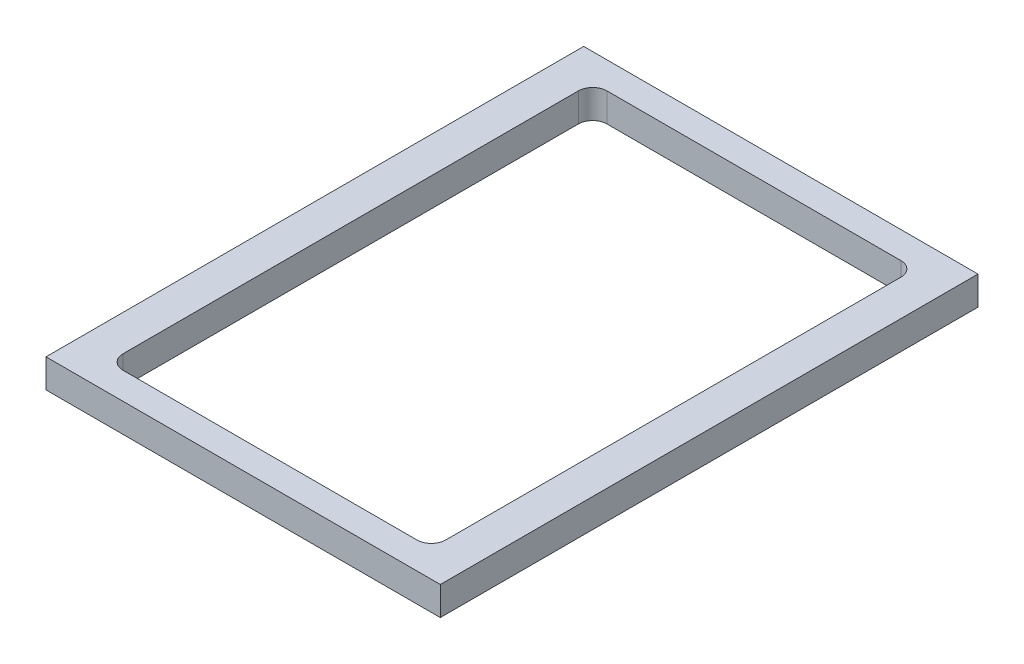
ISO-10303-21;
HEADER;
FILE_DESCRIPTION(('STEP AP214'),'2;1');
FILE_NAME('part.step','',(''),(''),'','','');
FILE_SCHEMA(('AUTOMOTIVE_DESIGN { 1 0 10303 214 1 1 1 1 }'));
ENDSEC;
DATA;
#1=APPLICATION_CONTEXT('core data for automotive mechanical design processes');
#2=APPLICATION_PROTOCOL_DEFINITION('international standard','automotive_design',2000,#1);
#3=PRODUCT_CONTEXT('',#1,'mechanical');
#4=PRODUCT('Part','Part','',(#3));
#5=PRODUCT_RELATED_PRODUCT_CATEGORY('part','',(#4));
#6=PRODUCT_DEFINITION_FORMATION('','',#4);
#7=PRODUCT_DEFINITION_CONTEXT('part definition',#1,'design');
#8=PRODUCT_DEFINITION('design','',#6,#7);
#9=PRODUCT_DEFINITION_SHAPE('','',#8);
#10=(LENGTH_UNIT() NAMED_UNIT(*) SI_UNIT(.MILLI.,.METRE.));
#11=(NAMED_UNIT(*) PLANE_ANGLE_UNIT() SI_UNIT($,.RADIAN.));
#12=(NAMED_UNIT(*) SI_UNIT($,.STERADIAN.) SOLID_ANGLE_UNIT());
#13=UNCERTAINTY_MEASURE_WITH_UNIT(LENGTH_MEASURE(1.E-05),#10,'distance_accuracy_value','');
#14=(GEOMETRIC_REPRESENTATION_CONTEXT(3) GLOBAL_UNCERTAINTY_ASSIGNED_CONTEXT((#13)) GLOBAL_UNIT_ASSIGNED_CONTEXT((#10,
#11,#12)) REPRESENTATION_CONTEXT('',''));
#15=CARTESIAN_POINT('',(0.,0.,0.));
#16=DIRECTION('',(0.,0.,1.));
#17=DIRECTION('',(1.,0.,0.));
#18=AXIS2_PLACEMENT_3D('',#15,#16,#17);
#19=CARTESIAN_POINT('',(-94.5,-113.7,10.5));
#20=DIRECTION('',(0.,0.,1.));
#21=DIRECTION('',(1.,0.,0.));
#22=AXIS2_PLACEMENT_3D('',#19,#20,#21);
#23=PLANE('',#22);
#24=DIRECTION('',(0.,-1.,0.));
#25=VECTOR('',#24,1.);
#26=CARTESIAN_POINT('',(87.,-113.7,10.5));
#27=LINE('',#26,#25);
#28=CARTESIAN_POINT('',(87.,-113.8,10.5));
#29=VERTEX_POINT('',#28);
#30=CARTESIAN_POINT('',(87.,-116.,10.5));
#31=VERTEX_POINT('',#30);
#32=EDGE_CURVE('E41',#29,#31,#27,.T.);
#33=ORIENTED_EDGE('',*,*,#32,.T.);
#34=DIRECTION('',(-1.,0.,0.));
#35=VECTOR('',#34,1.);
#36=CARTESIAN_POINT('',(-47.25,-116.,10.5));
#37=LINE('',#36,#35);
#38=CARTESIAN_POINT('',(-87.,-116.,10.5));
#39=VERTEX_POINT('',#38);
#40=EDGE_CURVE('E313',#31,#39,#37,.T.);
#41=ORIENTED_EDGE('',*,*,#40,.T.);
#42=DIRECTION('',(0.,-1.,0.));
#43=VECTOR('',#42,1.);
#44=CARTESIAN_POINT('',(-87.,-113.7,10.5));
#45=LINE('',#44,#43);
#46=CARTESIAN_POINT('',(-87.,-113.8,10.5));
#47=VERTEX_POINT('',#46);
#48=EDGE_CURVE('E10',#47,#39,#45,.T.);
#49=ORIENTED_EDGE('',*,*,#48,.F.);
#50=DIRECTION('',(-1.,0.,0.));
#51=VECTOR('',#50,1.);
#52=CARTESIAN_POINT('',(-47.25,-113.8,10.5));
#53=LINE('',#52,#51);
#54=EDGE_CURVE('E388',#29,#47,#53,.T.);
#55=ORIENTED_EDGE('',*,*,#54,.F.);
#56=EDGE_LOOP('',(#33,#41,#49,#55));
#57=FACE_BOUND('',#56,.T.);
#58=ADVANCED_FACE('F16',(#57),#23,.F.);
#59=CARTESIAN_POINT('',(-87.,-113.7,18.));
#60=DIRECTION('',(0.,-1.,0.));
#61=DIRECTION('',(0.,0.,-1.));
#62=AXIS2_PLACEMENT_3D('',#59,#60,#61);
#63=CYLINDRICAL_SURFACE('',#62,7.5);
#64=CARTESIAN_POINT('',(-87.,-116.,18.));
#65=DIRECTION('',(0.,-1.,0.));
#66=DIRECTION('',(0.,0.,-1.));
#67=AXIS2_PLACEMENT_3D('',#64,#65,#66);
#68=CIRCLE('',#67,7.5);
#69=CARTESIAN_POINT('',(-94.5,-116.,18.));
#70=VERTEX_POINT('',#69);
#71=EDGE_CURVE('E309',#70,#39,#68,.T.);
#72=ORIENTED_EDGE('',*,*,#71,.F.);
#73=DIRECTION('',(0.,-1.,0.));
#74=VECTOR('',#73,1.);
#75=CARTESIAN_POINT('',(-94.5,-113.7,18.));
#76=LINE('',#75,#74);
#77=CARTESIAN_POINT('',(-94.5,-113.8,18.));
#78=VERTEX_POINT('',#77);
#79=EDGE_CURVE('E27',#78,#70,#76,.T.);
#80=ORIENTED_EDGE('',*,*,#79,.F.);
#81=CARTESIAN_POINT('',(-87.,-113.8,18.));
#82=DIRECTION('',(0.,-1.,0.));
#83=DIRECTION('',(0.,0.,-1.));
#84=AXIS2_PLACEMENT_3D('',#81,#82,#83);
#85=CIRCLE('',#84,7.5);
#86=EDGE_CURVE('E384',#78,#47,#85,.T.);
#87=ORIENTED_EDGE('',*,*,#86,.T.);
#88=ORIENTED_EDGE('',*,*,#48,.T.);
#89=EDGE_LOOP('',(#72,#80,#87,#88));
#90=FACE_BOUND('',#89,.T.);
#91=ADVANCED_FACE('F689',(#90),#63,.T.);
#92=CARTESIAN_POINT('',(-94.5,-113.7,289.5));
#93=DIRECTION('',(1.,0.,0.));
#94=DIRECTION('',(0.,1.,0.));
#95=AXIS2_PLACEMENT_3D('',#92,#93,#94);
#96=PLANE('',#95);
#97=ORIENTED_EDGE('',*,*,#79,.T.);
#98=DIRECTION('',(0.,0.,1.));
#99=VECTOR('',#98,1.);
#100=CARTESIAN_POINT('',(-94.5,-116.,219.75));
#101=LINE('',#100,#99);
#102=CARTESIAN_POINT('',(-94.5,-116.,282.));
#103=VERTEX_POINT('',#102);
#104=EDGE_CURVE('E314',#70,#103,#101,.T.);
#105=ORIENTED_EDGE('',*,*,#104,.T.);
#106=DIRECTION('',(0.,-1.,0.));
#107=VECTOR('',#106,1.);
#108=CARTESIAN_POINT('',(-94.5,-113.7,282.));
#109=LINE('',#108,#107);
#110=CARTESIAN_POINT('',(-94.5,-113.8,282.));
#111=VERTEX_POINT('',#110);
#112=EDGE_CURVE('E300',#111,#103,#109,.T.);
#113=ORIENTED_EDGE('',*,*,#112,.F.);
#114=DIRECTION('',(0.,0.,1.));
#115=VECTOR('',#114,1.);
#116=CARTESIAN_POINT('',(-94.5,-113.8,219.75));
#117=LINE('',#116,#115);
#118=EDGE_CURVE('E350',#78,#111,#117,.T.);
#119=ORIENTED_EDGE('',*,*,#118,.F.);
#120=EDGE_LOOP('',(#97,#105,#113,#119));
#121=FACE_BOUND('',#120,.T.);
#122=ADVANCED_FACE('F543',(#121),#96,.F.);
#123=CARTESIAN_POINT('',(-87.,-113.7,282.));
#124=DIRECTION('',(0.,-1.,0.));
#125=DIRECTION('',(0.,0.,1.));
#126=AXIS2_PLACEMENT_3D('',#123,#124,#125);
#127=CYLINDRICAL_SURFACE('',#126,7.5);
#128=DIRECTION('',(0.,-1.,0.));
#129=VECTOR('',#128,1.);
#130=CARTESIAN_POINT('',(-87.,-113.7,289.5));
#131=LINE('',#130,#129);
#132=CARTESIAN_POINT('',(-87.,-113.8,289.5));
#133=VERTEX_POINT('',#132);
#134=CARTESIAN_POINT('',(-87.,-116.,289.5));
#135=VERTEX_POINT('',#134);
#136=EDGE_CURVE('E20',#133,#135,#131,.T.);
#137=ORIENTED_EDGE('',*,*,#136,.F.);
#138=CARTESIAN_POINT('',(-87.,-113.8,282.));
#139=DIRECTION('',(0.,-1.,0.));
#140=DIRECTION('',(0.,0.,1.));
#141=AXIS2_PLACEMENT_3D('',#138,#139,#140);
#142=CIRCLE('',#141,7.5);
#143=EDGE_CURVE('E345',#133,#111,#142,.T.);
#144=ORIENTED_EDGE('',*,*,#143,.T.);
#145=ORIENTED_EDGE('',*,*,#112,.T.);
#146=CARTESIAN_POINT('',(-87.,-116.,282.));
#147=DIRECTION('',(0.,-1.,0.));
#148=DIRECTION('',(0.,0.,1.));
#149=AXIS2_PLACEMENT_3D('',#146,#147,#148);
#150=CIRCLE('',#149,7.5);
#151=EDGE_CURVE('E427',#135,#103,#150,.T.);
#152=ORIENTED_EDGE('',*,*,#151,.F.);
#153=EDGE_LOOP('',(#137,#144,#145,#152));
#154=FACE_BOUND('',#153,.T.);
#155=ADVANCED_FACE('F701',(#154),#127,.T.);
#156=CARTESIAN_POINT('',(94.5,-113.7,289.5));
#157=DIRECTION('',(0.,0.,-1.));
#158=DIRECTION('',(0.,-1.,0.));
#159=AXIS2_PLACEMENT_3D('',#156,#157,#158);
#160=PLANE('',#159);
#161=ORIENTED_EDGE('',*,*,#136,.T.);
#162=DIRECTION('',(1.,0.,0.));
#163=VECTOR('',#162,1.);
#164=CARTESIAN_POINT('',(47.25,-116.,289.5));
#165=LINE('',#164,#163);
#166=CARTESIAN_POINT('',(87.,-116.,289.5));
#167=VERTEX_POINT('',#166);
#168=EDGE_CURVE('E418',#135,#167,#165,.T.);
#169=ORIENTED_EDGE('',*,*,#168,.T.);
#170=DIRECTION('',(0.,-1.,0.));
#171=VECTOR('',#170,1.);
#172=CARTESIAN_POINT('',(87.,-113.7,289.5));
#173=LINE('',#172,#171);
#174=CARTESIAN_POINT('',(87.,-113.8,289.5));
#175=VERTEX_POINT('',#174);
#176=EDGE_CURVE('E431',#175,#167,#173,.T.);
#177=ORIENTED_EDGE('',*,*,#176,.F.);
#178=DIRECTION('',(1.,0.,0.));
#179=VECTOR('',#178,1.);
#180=CARTESIAN_POINT('',(47.25,-113.8,289.5));
#181=LINE('',#180,#179);
#182=EDGE_CURVE('E349',#133,#175,#181,.T.);
#183=ORIENTED_EDGE('',*,*,#182,.F.);
#184=EDGE_LOOP('',(#161,#169,#177,#183));
#185=FACE_BOUND('',#184,.T.);
#186=ADVANCED_FACE('F589',(#185),#160,.F.);
#187=CARTESIAN_POINT('',(87.,-113.7,282.));
#188=DIRECTION('',(0.,-1.,0.));
#189=DIRECTION('',(1.,0.,0.));
#190=AXIS2_PLACEMENT_3D('',#187,#188,#189);
#191=CYLINDRICAL_SURFACE('',#190,7.5);
#192=DIRECTION('',(0.,-1.,0.));
#193=VECTOR('',#192,1.);
#194=CARTESIAN_POINT('',(94.5,-113.7,282.));
#195=LINE('',#194,#193);
#196=CARTESIAN_POINT('',(94.5,-113.8,282.));
#197=VERTEX_POINT('',#196);
#198=CARTESIAN_POINT('',(94.5,-116.,282.));
#199=VERTEX_POINT('',#198);
#200=EDGE_CURVE('E434',#197,#199,#195,.T.);
#201=ORIENTED_EDGE('',*,*,#200,.F.);
#202=CARTESIAN_POINT('',(87.,-113.8,282.));
#203=DIRECTION('',(0.,-1.,0.));
#204=DIRECTION('',(1.,0.,0.));
#205=AXIS2_PLACEMENT_3D('',#202,#203,#204);
#206=CIRCLE('',#205,7.5);
#207=EDGE_CURVE('E423',#197,#175,#206,.T.);
#208=ORIENTED_EDGE('',*,*,#207,.T.);
#209=ORIENTED_EDGE('',*,*,#176,.T.);
#210=CARTESIAN_POINT('',(87.,-116.,282.));
#211=DIRECTION('',(0.,-1.,0.));
#212=DIRECTION('',(1.,0.,0.));
#213=AXIS2_PLACEMENT_3D('',#210,#211,#212);
#214=CIRCLE('',#213,7.5);
#215=EDGE_CURVE('E414',#199,#167,#214,.T.);
#216=ORIENTED_EDGE('',*,*,#215,.F.);
#217=EDGE_LOOP('',(#201,#208,#209,#216));
#218=FACE_BOUND('',#217,.T.);
#219=ADVANCED_FACE('F584',(#218),#191,.T.);
#220=CARTESIAN_POINT('',(94.5,-113.7,10.5));
#221=DIRECTION('',(-1.,0.,0.));
#222=DIRECTION('',(0.,0.,1.));
#223=AXIS2_PLACEMENT_3D('',#220,#221,#222);
#224=PLANE('',#223);
#225=ORIENTED_EDGE('',*,*,#200,.T.);
#226=DIRECTION('',(0.,0.,-1.));
#227=VECTOR('',#226,1.);
#228=CARTESIAN_POINT('',(94.5,-116.,80.25));
#229=LINE('',#228,#227);
#230=CARTESIAN_POINT('',(94.5,-116.,18.));
#231=VERTEX_POINT('',#230);
#232=EDGE_CURVE('E419',#199,#231,#229,.T.);
#233=ORIENTED_EDGE('',*,*,#232,.T.);
#234=DIRECTION('',(0.,-1.,0.));
#235=VECTOR('',#234,1.);
#236=CARTESIAN_POINT('',(94.5,-113.7,18.));
#237=LINE('',#236,#235);
#238=CARTESIAN_POINT('',(94.5,-113.8,18.));
#239=VERTEX_POINT('',#238);
#240=EDGE_CURVE('E290',#239,#231,#237,.T.);
#241=ORIENTED_EDGE('',*,*,#240,.F.);
#242=DIRECTION('',(0.,0.,-1.));
#243=VECTOR('',#242,1.);
#244=CARTESIAN_POINT('',(94.5,-113.8,80.25));
#245=LINE('',#244,#243);
#246=EDGE_CURVE('E454',#197,#239,#245,.T.);
#247=ORIENTED_EDGE('',*,*,#246,.F.);
#248=EDGE_LOOP('',(#225,#233,#241,#247));
#249=FACE_BOUND('',#248,.T.);
#250=ADVANCED_FACE('F592',(#249),#224,.F.);
#251=CARTESIAN_POINT('',(87.,-113.7,18.));
#252=DIRECTION('',(0.,-1.,0.));
#253=DIRECTION('',(0.,0.,-1.));
#254=AXIS2_PLACEMENT_3D('',#251,#252,#253);
#255=CYLINDRICAL_SURFACE('',#254,7.5);
#256=ORIENTED_EDGE('',*,*,#32,.F.);
#257=CARTESIAN_POINT('',(87.,-113.8,18.));
#258=DIRECTION('',(0.,-1.,0.));
#259=DIRECTION('',(0.,0.,-1.));
#260=AXIS2_PLACEMENT_3D('',#257,#258,#259);
#261=CIRCLE('',#260,7.5);
#262=EDGE_CURVE('E413',#29,#239,#261,.T.);
#263=ORIENTED_EDGE('',*,*,#262,.T.);
#264=ORIENTED_EDGE('',*,*,#240,.T.);
#265=CARTESIAN_POINT('',(87.,-116.,18.));
#266=DIRECTION('',(0.,-1.,0.));
#267=DIRECTION('',(0.,0.,-1.));
#268=AXIS2_PLACEMENT_3D('',#265,#266,#267);
#269=CIRCLE('',#268,7.5);
#270=EDGE_CURVE('E356',#31,#231,#269,.T.);
#271=ORIENTED_EDGE('',*,*,#270,.F.);
#272=EDGE_LOOP('',(#256,#263,#264,#271));
#273=FACE_BOUND('',#272,.T.);
#274=ADVANCED_FACE('F18',(#273),#255,.T.);
#275=CARTESIAN_POINT('',(-110.,-116.,0.));
#276=DIRECTION('',(0.,1.,0.));
#277=DIRECTION('',(1.,0.,0.));
#278=AXIS2_PLACEMENT_3D('',#275,#276,#277);
#279=PLANE('',#278);
#280=DIRECTION('',(0.,0.,-1.));
#281=VECTOR('',#280,1.);
#282=CARTESIAN_POINT('',(-90.,-116.,142.5));
#283=LINE('',#282,#281);
#284=CARTESIAN_POINT('',(-90.,-116.,277.));
#285=VERTEX_POINT('',#284);
#286=CARTESIAN_POINT('',(-90.,-116.,23.));
#287=VERTEX_POINT('',#286);
#288=EDGE_CURVE('E188',#285,#287,#283,.T.);
#289=ORIENTED_EDGE('',*,*,#288,.F.);
#290=CARTESIAN_POINT('',(-82.,-116.,277.));
#291=DIRECTION('',(0.,-1.,0.));
#292=DIRECTION('',(0.,0.,1.));
#293=AXIS2_PLACEMENT_3D('',#290,#291,#292);
#294=CIRCLE('',#293,8.);
#295=CARTESIAN_POINT('',(-82.,-116.,285.));
#296=VERTEX_POINT('',#295);
#297=EDGE_CURVE('E365',#296,#285,#294,.T.);
#298=ORIENTED_EDGE('',*,*,#297,.F.);
#299=DIRECTION('',(-1.,0.,0.));
#300=VECTOR('',#299,1.);
#301=CARTESIAN_POINT('',(-10.,-116.,285.));
#302=LINE('',#301,#300);
#303=CARTESIAN_POINT('',(82.,-116.,285.));
#304=VERTEX_POINT('',#303);
#305=EDGE_CURVE('E296',#304,#296,#302,.T.);
#306=ORIENTED_EDGE('',*,*,#305,.F.);
#307=CARTESIAN_POINT('',(82.,-116.,277.));
#308=DIRECTION('',(0.,-1.,0.));
#309=DIRECTION('',(1.,0.,0.));
#310=AXIS2_PLACEMENT_3D('',#307,#308,#309);
#311=CIRCLE('',#310,8.);
#312=CARTESIAN_POINT('',(90.,-116.,277.));
#313=VERTEX_POINT('',#312);
#314=EDGE_CURVE('E270',#313,#304,#311,.T.);
#315=ORIENTED_EDGE('',*,*,#314,.F.);
#316=DIRECTION('',(0.,0.,1.));
#317=VECTOR('',#316,1.);
#318=CARTESIAN_POINT('',(90.,-116.,7.5));
#319=LINE('',#318,#317);
#320=CARTESIAN_POINT('',(90.,-116.,23.));
#321=VERTEX_POINT('',#320);
#322=EDGE_CURVE('E263',#321,#313,#319,.T.);
#323=ORIENTED_EDGE('',*,*,#322,.F.);
#324=CARTESIAN_POINT('',(82.,-116.,23.));
#325=DIRECTION('',(0.,-1.,0.));
#326=DIRECTION('',(0.,0.,-1.));
#327=AXIS2_PLACEMENT_3D('',#324,#325,#326);
#328=CIRCLE('',#327,8.);
#329=CARTESIAN_POINT('',(82.,-116.,15.));
#330=VERTEX_POINT('',#329);
#331=EDGE_CURVE('E253',#330,#321,#328,.T.);
#332=ORIENTED_EDGE('',*,*,#331,.F.);
#333=DIRECTION('',(1.,0.,0.));
#334=VECTOR('',#333,1.);
#335=CARTESIAN_POINT('',(-100.,-116.,15.));
#336=LINE('',#335,#334);
#337=CARTESIAN_POINT('',(-82.,-116.,15.));
#338=VERTEX_POINT('',#337);
#339=EDGE_CURVE('E199',#338,#330,#336,.T.);
#340=ORIENTED_EDGE('',*,*,#339,.F.);
#341=CARTESIAN_POINT('',(-82.,-116.,23.));
#342=DIRECTION('',(0.,-1.,0.));
#343=DIRECTION('',(0.,0.,-1.));
#344=AXIS2_PLACEMENT_3D('',#341,#342,#343);
#345=CIRCLE('',#344,8.);
#346=EDGE_CURVE('E307',#287,#338,#345,.T.);
#347=ORIENTED_EDGE('',*,*,#346,.F.);
#348=EDGE_LOOP('',(#289,#298,#306,#315,#323,#332,#340,#347));
#349=FACE_BOUND('',#348,.T.);
#350=ORIENTED_EDGE('',*,*,#232,.F.);
#351=ORIENTED_EDGE('',*,*,#215,.T.);
#352=ORIENTED_EDGE('',*,*,#168,.F.);
#353=ORIENTED_EDGE('',*,*,#151,.T.);
#354=ORIENTED_EDGE('',*,*,#104,.F.);
#355=ORIENTED_EDGE('',*,*,#71,.T.);
#356=ORIENTED_EDGE('',*,*,#40,.F.);
#357=ORIENTED_EDGE('',*,*,#270,.T.);
#358=EDGE_LOOP('',(#350,#351,#352,#353,#354,#355,#356,#357));
#359=FACE_BOUND('',#358,.T.);
#360=ADVANCED_FACE('F266',(#349,#359),#279,.F.);
#361=CARTESIAN_POINT('',(0.,-113.8,150.));
#362=DIRECTION('',(0.,-1.,0.));
#363=DIRECTION('',(0.,0.,-1.));
#364=AXIS2_PLACEMENT_3D('',#361,#362,#363);
#365=PLANE('',#364);
#366=ORIENTED_EDGE('',*,*,#262,.F.);
#367=ORIENTED_EDGE('',*,*,#54,.T.);
#368=ORIENTED_EDGE('',*,*,#86,.F.);
#369=ORIENTED_EDGE('',*,*,#118,.T.);
#370=ORIENTED_EDGE('',*,*,#143,.F.);
#371=ORIENTED_EDGE('',*,*,#182,.T.);
#372=ORIENTED_EDGE('',*,*,#207,.F.);
#373=ORIENTED_EDGE('',*,*,#246,.T.);
#374=EDGE_LOOP('',(#366,#367,#368,#369,#370,#371,#372,#373));
#375=FACE_BOUND('',#374,.T.);
#376=DIRECTION('',(1.,0.,0.));
#377=VECTOR('',#376,1.);
#378=CARTESIAN_POINT('',(-99.,-113.8,6.));
#379=LINE('',#378,#377);
#380=CARTESIAN_POINT('',(-87.,-113.8,6.));
#381=VERTEX_POINT('',#380);
#382=CARTESIAN_POINT('',(87.,-113.8,6.));
#383=VERTEX_POINT('',#382);
#384=EDGE_CURVE('E496',#381,#383,#379,.T.);
#385=ORIENTED_EDGE('',*,*,#384,.T.);
#386=CARTESIAN_POINT('',(87.,-113.8,18.));
#387=DIRECTION('',(0.,-1.,0.));
#388=DIRECTION('',(0.,0.,-1.));
#389=AXIS2_PLACEMENT_3D('',#386,#387,#388);
#390=CIRCLE('',#389,12.);
#391=CARTESIAN_POINT('',(99.,-113.8,18.));
#392=VERTEX_POINT('',#391);
#393=EDGE_CURVE('E327',#383,#392,#390,.T.);
#394=ORIENTED_EDGE('',*,*,#393,.T.);
#395=DIRECTION('',(0.,0.,1.));
#396=VECTOR('',#395,1.);
#397=CARTESIAN_POINT('',(99.,-113.8,6.));
#398=LINE('',#397,#396);
#399=CARTESIAN_POINT('',(99.,-113.8,282.));
#400=VERTEX_POINT('',#399);
#401=EDGE_CURVE('E383',#392,#400,#398,.T.);
#402=ORIENTED_EDGE('',*,*,#401,.T.);
#403=CARTESIAN_POINT('',(87.,-113.8,282.));
#404=DIRECTION('',(0.,-1.,0.));
#405=DIRECTION('',(0.,0.,-1.));
#406=AXIS2_PLACEMENT_3D('',#403,#404,#405);
#407=CIRCLE('',#406,12.);
#408=CARTESIAN_POINT('',(87.,-113.8,294.));
#409=VERTEX_POINT('',#408);
#410=EDGE_CURVE('E379',#400,#409,#407,.T.);
#411=ORIENTED_EDGE('',*,*,#410,.T.);
#412=DIRECTION('',(-1.,0.,0.));
#413=VECTOR('',#412,1.);
#414=CARTESIAN_POINT('',(99.,-113.8,294.));
#415=LINE('',#414,#413);
#416=CARTESIAN_POINT('',(-87.,-113.8,294.));
#417=VERTEX_POINT('',#416);
#418=EDGE_CURVE('E340',#409,#417,#415,.T.);
#419=ORIENTED_EDGE('',*,*,#418,.T.);
#420=CARTESIAN_POINT('',(-87.,-113.8,282.));
#421=DIRECTION('',(0.,-1.,0.));
#422=DIRECTION('',(0.,0.,-1.));
#423=AXIS2_PLACEMENT_3D('',#420,#421,#422);
#424=CIRCLE('',#423,12.);
#425=CARTESIAN_POINT('',(-99.,-113.8,282.));
#426=VERTEX_POINT('',#425);
#427=EDGE_CURVE('E343',#417,#426,#424,.T.);
#428=ORIENTED_EDGE('',*,*,#427,.T.);
#429=DIRECTION('',(0.,0.,-1.));
#430=VECTOR('',#429,1.);
#431=CARTESIAN_POINT('',(-99.,-113.8,294.));
#432=LINE('',#431,#430);
#433=CARTESIAN_POINT('',(-99.,-113.8,18.));
#434=VERTEX_POINT('',#433);
#435=EDGE_CURVE('E357',#426,#434,#432,.T.);
#436=ORIENTED_EDGE('',*,*,#435,.T.);
#437=CARTESIAN_POINT('',(-87.,-113.8,18.));
#438=DIRECTION('',(0.,1.,0.));
#439=DIRECTION('',(0.,0.,-1.));
#440=AXIS2_PLACEMENT_3D('',#437,#438,#439);
#441=CIRCLE('',#440,12.);
#442=EDGE_CURVE('E294',#381,#434,#441,.T.);
#443=ORIENTED_EDGE('',*,*,#442,.F.);
#444=EDGE_LOOP('',(#385,#394,#402,#411,#419,#428,#436,#443));
#445=FACE_BOUND('',#444,.T.);
#446=ADVANCED_FACE('F538',(#375,#445),#365,.T.);
#447=CARTESIAN_POINT('',(-90.,-99.,15.));
#448=DIRECTION('',(0.,0.,1.));
#449=DIRECTION('',(1.,0.,0.));
#450=AXIS2_PLACEMENT_3D('',#447,#448,#449);
#451=PLANE('',#450);
#452=DIRECTION('',(1.,0.,0.));
#453=VECTOR('',#452,1.);
#454=CARTESIAN_POINT('',(-100.,-100.,15.));
#455=LINE('',#454,#453);
#456=CARTESIAN_POINT('',(-82.,-100.,15.));
#457=VERTEX_POINT('',#456);
#458=CARTESIAN_POINT('',(82.,-100.,15.));
#459=VERTEX_POINT('',#458);
#460=EDGE_CURVE('E335',#457,#459,#455,.T.);
#461=ORIENTED_EDGE('',*,*,#460,.F.);
#462=DIRECTION('',(0.,-1.,0.));
#463=VECTOR('',#462,1.);
#464=CARTESIAN_POINT('',(-82.,-99.,15.));
#465=LINE('',#464,#463);
#466=EDGE_CURVE('E308',#457,#338,#465,.T.);
#467=ORIENTED_EDGE('',*,*,#466,.T.);
#468=ORIENTED_EDGE('',*,*,#339,.T.);
#469=DIRECTION('',(0.,-1.,0.));
#470=VECTOR('',#469,1.);
#471=CARTESIAN_POINT('',(82.,-99.,15.));
#472=LINE('',#471,#470);
#473=EDGE_CURVE('E261',#459,#330,#472,.T.);
#474=ORIENTED_EDGE('',*,*,#473,.F.);
#475=EDGE_LOOP('',(#461,#467,#468,#474));
#476=FACE_BOUND('',#475,.T.);
#477=ADVANCED_FACE('F566',(#476),#451,.T.);
#478=CARTESIAN_POINT('',(82.,-99.,23.));
#479=DIRECTION('',(0.,-1.,0.));
#480=DIRECTION('',(0.,0.,-1.));
#481=AXIS2_PLACEMENT_3D('',#478,#479,#480);
#482=CYLINDRICAL_SURFACE('',#481,8.);
#483=ORIENTED_EDGE('',*,*,#331,.T.);
#484=DIRECTION('',(0.,-1.,0.));
#485=VECTOR('',#484,1.);
#486=CARTESIAN_POINT('',(90.,-99.,23.));
#487=LINE('',#486,#485);
#488=CARTESIAN_POINT('',(90.,-100.,23.));
#489=VERTEX_POINT('',#488);
#490=EDGE_CURVE('E258',#489,#321,#487,.T.);
#491=ORIENTED_EDGE('',*,*,#490,.F.);
#492=CARTESIAN_POINT('',(82.,-100.,23.));
#493=DIRECTION('',(0.,-1.,0.));
#494=DIRECTION('',(0.,0.,-1.));
#495=AXIS2_PLACEMENT_3D('',#492,#493,#494);
#496=CIRCLE('',#495,8.);
#497=EDGE_CURVE('E323',#459,#489,#496,.T.);
#498=ORIENTED_EDGE('',*,*,#497,.F.);
#499=ORIENTED_EDGE('',*,*,#473,.T.);
#500=EDGE_LOOP('',(#483,#491,#498,#499));
#501=FACE_BOUND('',#500,.T.);
#502=ADVANCED_FACE('F255',(#501),#482,.F.);
#503=CARTESIAN_POINT('',(90.,-99.,15.));
#504=DIRECTION('',(-1.,0.,0.));
#505=DIRECTION('',(0.,0.,1.));
#506=AXIS2_PLACEMENT_3D('',#503,#504,#505);
#507=PLANE('',#506);
#508=DIRECTION('',(0.,0.,1.));
#509=VECTOR('',#508,1.);
#510=CARTESIAN_POINT('',(90.,-100.,7.5));
#511=LINE('',#510,#509);
#512=CARTESIAN_POINT('',(90.,-100.,277.));
#513=VERTEX_POINT('',#512);
#514=EDGE_CURVE('E278',#489,#513,#511,.T.);
#515=ORIENTED_EDGE('',*,*,#514,.F.);
#516=ORIENTED_EDGE('',*,*,#490,.T.);
#517=ORIENTED_EDGE('',*,*,#322,.T.);
#518=DIRECTION('',(0.,-1.,0.));
#519=VECTOR('',#518,1.);
#520=CARTESIAN_POINT('',(90.,-99.,277.));
#521=LINE('',#520,#519);
#522=EDGE_CURVE('E281',#513,#313,#521,.T.);
#523=ORIENTED_EDGE('',*,*,#522,.F.);
#524=EDGE_LOOP('',(#515,#516,#517,#523));
#525=FACE_BOUND('',#524,.T.);
#526=ADVANCED_FACE('F276',(#525),#507,.T.);
#527=CARTESIAN_POINT('',(82.,-99.,277.));
#528=DIRECTION('',(0.,-1.,0.));
#529=DIRECTION('',(1.,0.,0.));
#530=AXIS2_PLACEMENT_3D('',#527,#528,#529);
#531=CYLINDRICAL_SURFACE('',#530,8.);
#532=ORIENTED_EDGE('',*,*,#314,.T.);
#533=DIRECTION('',(0.,-1.,0.));
#534=VECTOR('',#533,1.);
#535=CARTESIAN_POINT('',(82.,-99.,285.));
#536=LINE('',#535,#534);
#537=CARTESIAN_POINT('',(82.,-100.,285.));
#538=VERTEX_POINT('',#537);
#539=EDGE_CURVE('E299',#538,#304,#536,.T.);
#540=ORIENTED_EDGE('',*,*,#539,.F.);
#541=CARTESIAN_POINT('',(82.,-100.,277.));
#542=DIRECTION('',(0.,-1.,0.));
#543=DIRECTION('',(1.,0.,0.));
#544=AXIS2_PLACEMENT_3D('',#541,#542,#543);
#545=CIRCLE('',#544,8.);
#546=EDGE_CURVE('E322',#513,#538,#545,.T.);
#547=ORIENTED_EDGE('',*,*,#546,.F.);
#548=ORIENTED_EDGE('',*,*,#522,.T.);
#549=EDGE_LOOP('',(#532,#540,#547,#548));
#550=FACE_BOUND('',#549,.T.);
#551=ADVANCED_FACE('F705',(#550),#531,.F.);
#552=CARTESIAN_POINT('',(90.,-99.,285.));
#553=DIRECTION('',(0.,0.,-1.));
#554=DIRECTION('',(0.,-1.,0.));
#555=AXIS2_PLACEMENT_3D('',#552,#553,#554);
#556=PLANE('',#555);
#557=DIRECTION('',(-1.,0.,0.));
#558=VECTOR('',#557,1.);
#559=CARTESIAN_POINT('',(-10.,-100.,285.));
#560=LINE('',#559,#558);
#561=CARTESIAN_POINT('',(-82.,-100.,285.));
#562=VERTEX_POINT('',#561);
#563=EDGE_CURVE('E332',#538,#562,#560,.T.);
#564=ORIENTED_EDGE('',*,*,#563,.F.);
#565=ORIENTED_EDGE('',*,*,#539,.T.);
#566=ORIENTED_EDGE('',*,*,#305,.T.);
#567=DIRECTION('',(0.,-1.,0.));
#568=VECTOR('',#567,1.);
#569=CARTESIAN_POINT('',(-82.,-99.,285.));
#570=LINE('',#569,#568);
#571=EDGE_CURVE('E368',#562,#296,#570,.T.);
#572=ORIENTED_EDGE('',*,*,#571,.F.);
#573=EDGE_LOOP('',(#564,#565,#566,#572));
#574=FACE_BOUND('',#573,.T.);
#575=ADVANCED_FACE('F725',(#574),#556,.T.);
#576=CARTESIAN_POINT('',(-82.,-99.,277.));
#577=DIRECTION('',(0.,-1.,0.));
#578=DIRECTION('',(0.,0.,1.));
#579=AXIS2_PLACEMENT_3D('',#576,#577,#578);
#580=CYLINDRICAL_SURFACE('',#579,8.);
#581=ORIENTED_EDGE('',*,*,#297,.T.);
#582=DIRECTION('',(0.,-1.,0.));
#583=VECTOR('',#582,1.);
#584=CARTESIAN_POINT('',(-90.,-99.,277.));
#585=LINE('',#584,#583);
#586=CARTESIAN_POINT('',(-90.,-100.,277.));
#587=VERTEX_POINT('',#586);
#588=EDGE_CURVE('E467',#587,#285,#585,.T.);
#589=ORIENTED_EDGE('',*,*,#588,.F.);
#590=CARTESIAN_POINT('',(-82.,-100.,277.));
#591=DIRECTION('',(0.,-1.,0.));
#592=DIRECTION('',(0.,0.,1.));
#593=AXIS2_PLACEMENT_3D('',#590,#591,#592);
#594=CIRCLE('',#593,8.);
#595=EDGE_CURVE('E369',#562,#587,#594,.T.);
#596=ORIENTED_EDGE('',*,*,#595,.F.);
#597=ORIENTED_EDGE('',*,*,#571,.T.);
#598=EDGE_LOOP('',(#581,#589,#596,#597));
#599=FACE_BOUND('',#598,.T.);
#600=ADVANCED_FACE('F721',(#599),#580,.F.);
#601=CARTESIAN_POINT('',(-90.,-99.,285.));
#602=DIRECTION('',(1.,0.,0.));
#603=DIRECTION('',(0.,1.,0.));
#604=AXIS2_PLACEMENT_3D('',#601,#602,#603);
#605=PLANE('',#604);
#606=DIRECTION('',(0.,0.,-1.));
#607=VECTOR('',#606,1.);
#608=CARTESIAN_POINT('',(-90.,-100.,142.5));
#609=LINE('',#608,#607);
#610=CARTESIAN_POINT('',(-90.,-100.,23.));
#611=VERTEX_POINT('',#610);
#612=EDGE_CURVE('E295',#587,#611,#609,.T.);
#613=ORIENTED_EDGE('',*,*,#612,.F.);
#614=ORIENTED_EDGE('',*,*,#588,.T.);
#615=ORIENTED_EDGE('',*,*,#288,.T.);
#616=DIRECTION('',(0.,-1.,0.));
#617=VECTOR('',#616,1.);
#618=CARTESIAN_POINT('',(-90.,-99.,23.));
#619=LINE('',#618,#617);
#620=EDGE_CURVE('E303',#611,#287,#619,.T.);
#621=ORIENTED_EDGE('',*,*,#620,.F.);
#622=EDGE_LOOP('',(#613,#614,#615,#621));
#623=FACE_BOUND('',#622,.T.);
#624=ADVANCED_FACE('F724',(#623),#605,.T.);
#625=CARTESIAN_POINT('',(-82.,-99.,23.));
#626=DIRECTION('',(0.,-1.,0.));
#627=DIRECTION('',(0.,0.,-1.));
#628=AXIS2_PLACEMENT_3D('',#625,#626,#627);
#629=CYLINDRICAL_SURFACE('',#628,8.);
#630=ORIENTED_EDGE('',*,*,#466,.F.);
#631=CARTESIAN_POINT('',(-82.,-100.,23.));
#632=DIRECTION('',(0.,-1.,0.));
#633=DIRECTION('',(0.,0.,-1.));
#634=AXIS2_PLACEMENT_3D('',#631,#632,#633);
#635=CIRCLE('',#634,8.);
#636=EDGE_CURVE('E339',#611,#457,#635,.T.);
#637=ORIENTED_EDGE('',*,*,#636,.F.);
#638=ORIENTED_EDGE('',*,*,#620,.T.);
#639=ORIENTED_EDGE('',*,*,#346,.T.);
#640=EDGE_LOOP('',(#630,#637,#638,#639));
#641=FACE_BOUND('',#640,.T.);
#642=ADVANCED_FACE('F573',(#641),#629,.F.);
#643=CARTESIAN_POINT('',(-99.,-113.8,6.));
#644=DIRECTION('',(0.,0.,1.));
#645=DIRECTION('',(1.,0.,0.));
#646=AXIS2_PLACEMENT_3D('',#643,#644,#645);
#647=PLANE('',#646);
#648=ORIENTED_EDGE('',*,*,#384,.F.);
#649=DIRECTION('',(0.,-1.,0.));
#650=VECTOR('',#649,1.);
#651=CARTESIAN_POINT('',(-87.,-113.8,6.));
#652=LINE('',#651,#650);
#653=CARTESIAN_POINT('',(-87.,-116.,6.));
#654=VERTEX_POINT('',#653);
#655=EDGE_CURVE('E360',#381,#654,#652,.T.);
#656=ORIENTED_EDGE('',*,*,#655,.T.);
#657=DIRECTION('',(1.,0.,0.));
#658=VECTOR('',#657,1.);
#659=CARTESIAN_POINT('',(-99.,-116.,6.));
#660=LINE('',#659,#658);
#661=CARTESIAN_POINT('',(87.,-116.,6.));
#662=VERTEX_POINT('',#661);
#663=EDGE_CURVE('E393',#654,#662,#660,.T.);
#664=ORIENTED_EDGE('',*,*,#663,.T.);
#665=DIRECTION('',(0.,-1.,0.));
#666=VECTOR('',#665,1.);
#667=CARTESIAN_POINT('',(87.,-113.8,6.));
#668=LINE('',#667,#666);
#669=EDGE_CURVE('E324',#383,#662,#668,.T.);
#670=ORIENTED_EDGE('',*,*,#669,.F.);
#671=EDGE_LOOP('',(#648,#656,#664,#670));
#672=FACE_BOUND('',#671,.T.);
#673=ADVANCED_FACE('F654',(#672),#647,.T.);
#674=CARTESIAN_POINT('',(87.,-113.8,18.));
#675=DIRECTION('',(0.,-1.,0.));
#676=DIRECTION('',(0.,0.,-1.));
#677=AXIS2_PLACEMENT_3D('',#674,#675,#676);
#678=CYLINDRICAL_SURFACE('',#677,12.);
#679=ORIENTED_EDGE('',*,*,#669,.T.);
#680=CARTESIAN_POINT('',(87.,-116.,18.));
#681=DIRECTION('',(0.,-1.,0.));
#682=DIRECTION('',(0.,0.,-1.));
#683=AXIS2_PLACEMENT_3D('',#680,#681,#682);
#684=CIRCLE('',#683,12.);
#685=CARTESIAN_POINT('',(99.,-116.,18.));
#686=VERTEX_POINT('',#685);
#687=EDGE_CURVE('E389',#662,#686,#684,.T.);
#688=ORIENTED_EDGE('',*,*,#687,.T.);
#689=DIRECTION('',(0.,-1.,0.));
#690=VECTOR('',#689,1.);
#691=CARTESIAN_POINT('',(99.,-113.8,18.));
#692=LINE('',#691,#690);
#693=EDGE_CURVE('E328',#392,#686,#692,.T.);
#694=ORIENTED_EDGE('',*,*,#693,.F.);
#695=ORIENTED_EDGE('',*,*,#393,.F.);
#696=EDGE_LOOP('',(#679,#688,#694,#695));
#697=FACE_BOUND('',#696,.T.);
#698=ADVANCED_FACE('F734',(#697),#678,.F.);
#699=CARTESIAN_POINT('',(99.,-113.8,6.));
#700=DIRECTION('',(-1.,0.,0.));
#701=DIRECTION('',(0.,0.,1.));
#702=AXIS2_PLACEMENT_3D('',#699,#700,#701);
#703=PLANE('',#702);
#704=ORIENTED_EDGE('',*,*,#401,.F.);
#705=ORIENTED_EDGE('',*,*,#693,.T.);
#706=DIRECTION('',(0.,0.,1.));
#707=VECTOR('',#706,1.);
#708=CARTESIAN_POINT('',(99.,-116.,6.));
#709=LINE('',#708,#707);
#710=CARTESIAN_POINT('',(99.,-116.,282.));
#711=VERTEX_POINT('',#710);
#712=EDGE_CURVE('E394',#686,#711,#709,.T.);
#713=ORIENTED_EDGE('',*,*,#712,.T.);
#714=DIRECTION('',(0.,-1.,0.));
#715=VECTOR('',#714,1.);
#716=CARTESIAN_POINT('',(99.,-113.8,282.));
#717=LINE('',#716,#715);
#718=EDGE_CURVE('E378',#400,#711,#717,.T.);
#719=ORIENTED_EDGE('',*,*,#718,.F.);
#720=EDGE_LOOP('',(#704,#705,#713,#719));
#721=FACE_BOUND('',#720,.T.);
#722=ADVANCED_FACE('F629',(#721),#703,.T.);
#723=CARTESIAN_POINT('',(87.,-113.8,282.));
#724=DIRECTION('',(0.,-1.,0.));
#725=DIRECTION('',(1.,0.,0.));
#726=AXIS2_PLACEMENT_3D('',#723,#724,#725);
#727=CYLINDRICAL_SURFACE('',#726,12.);
#728=ORIENTED_EDGE('',*,*,#718,.T.);
#729=CARTESIAN_POINT('',(87.,-116.,282.));
#730=DIRECTION('',(0.,-1.,0.));
#731=DIRECTION('',(0.,0.,-1.));
#732=AXIS2_PLACEMENT_3D('',#729,#730,#731);
#733=CIRCLE('',#732,12.);
#734=CARTESIAN_POINT('',(87.,-116.,294.));
#735=VERTEX_POINT('',#734);
#736=EDGE_CURVE('E510',#711,#735,#733,.T.);
#737=ORIENTED_EDGE('',*,*,#736,.T.);
#738=DIRECTION('',(0.,-1.,0.));
#739=VECTOR('',#738,1.);
#740=CARTESIAN_POINT('',(87.,-113.8,294.));
#741=LINE('',#740,#739);
#742=EDGE_CURVE('E342',#409,#735,#741,.T.);
#743=ORIENTED_EDGE('',*,*,#742,.F.);
#744=ORIENTED_EDGE('',*,*,#410,.F.);
#745=EDGE_LOOP('',(#728,#737,#743,#744));
#746=FACE_BOUND('',#745,.T.);
#747=ADVANCED_FACE('F622',(#746),#727,.F.);
#748=CARTESIAN_POINT('',(99.,-113.8,294.));
#749=DIRECTION('',(0.,0.,-1.));
#750=DIRECTION('',(0.,-1.,0.));
#751=AXIS2_PLACEMENT_3D('',#748,#749,#750);
#752=PLANE('',#751);
#753=ORIENTED_EDGE('',*,*,#418,.F.);
#754=ORIENTED_EDGE('',*,*,#742,.T.);
#755=DIRECTION('',(-1.,0.,0.));
#756=VECTOR('',#755,1.);
#757=CARTESIAN_POINT('',(99.,-116.,294.));
#758=LINE('',#757,#756);
#759=CARTESIAN_POINT('',(-87.,-116.,294.));
#760=VERTEX_POINT('',#759);
#761=EDGE_CURVE('E506',#735,#760,#758,.T.);
#762=ORIENTED_EDGE('',*,*,#761,.T.);
#763=DIRECTION('',(0.,-1.,0.));
#764=VECTOR('',#763,1.);
#765=CARTESIAN_POINT('',(-87.,-113.8,294.));
#766=LINE('',#765,#764);
#767=EDGE_CURVE('E353',#417,#760,#766,.T.);
#768=ORIENTED_EDGE('',*,*,#767,.F.);
#769=EDGE_LOOP('',(#753,#754,#762,#768));
#770=FACE_BOUND('',#769,.T.);
#771=ADVANCED_FACE('F640',(#770),#752,.T.);
#772=CARTESIAN_POINT('',(-87.,-113.8,282.));
#773=DIRECTION('',(0.,-1.,0.));
#774=DIRECTION('',(0.,0.,1.));
#775=AXIS2_PLACEMENT_3D('',#772,#773,#774);
#776=CYLINDRICAL_SURFACE('',#775,12.);
#777=ORIENTED_EDGE('',*,*,#767,.T.);
#778=CARTESIAN_POINT('',(-87.,-116.,282.));
#779=DIRECTION('',(0.,-1.,0.));
#780=DIRECTION('',(0.,0.,-1.));
#781=AXIS2_PLACEMENT_3D('',#778,#779,#780);
#782=CIRCLE('',#781,12.);
#783=CARTESIAN_POINT('',(-99.,-116.,282.));
#784=VERTEX_POINT('',#783);
#785=EDGE_CURVE('E464',#760,#784,#782,.T.);
#786=ORIENTED_EDGE('',*,*,#785,.T.);
#787=DIRECTION('',(0.,-1.,0.));
#788=VECTOR('',#787,1.);
#789=CARTESIAN_POINT('',(-99.,-113.8,282.));
#790=LINE('',#789,#788);
#791=EDGE_CURVE('E157',#426,#784,#790,.T.);
#792=ORIENTED_EDGE('',*,*,#791,.F.);
#793=ORIENTED_EDGE('',*,*,#427,.F.);
#794=EDGE_LOOP('',(#777,#786,#792,#793));
#795=FACE_BOUND('',#794,.T.);
#796=ADVANCED_FACE('F643',(#795),#776,.F.);
#797=CARTESIAN_POINT('',(-99.,-113.8,294.));
#798=DIRECTION('',(1.,0.,0.));
#799=DIRECTION('',(0.,1.,0.));
#800=AXIS2_PLACEMENT_3D('',#797,#798,#799);
#801=PLANE('',#800);
#802=ORIENTED_EDGE('',*,*,#435,.F.);
#803=ORIENTED_EDGE('',*,*,#791,.T.);
#804=DIRECTION('',(0.,0.,-1.));
#805=VECTOR('',#804,1.);
#806=CARTESIAN_POINT('',(-99.,-116.,294.));
#807=LINE('',#806,#805);
#808=CARTESIAN_POINT('',(-99.,-116.,18.));
#809=VERTEX_POINT('',#808);
#810=EDGE_CURVE('E461',#784,#809,#807,.T.);
#811=ORIENTED_EDGE('',*,*,#810,.T.);
#812=DIRECTION('',(0.,-1.,0.));
#813=VECTOR('',#812,1.);
#814=CARTESIAN_POINT('',(-99.,-113.8,18.));
#815=LINE('',#814,#813);
#816=EDGE_CURVE('E408',#434,#809,#815,.T.);
#817=ORIENTED_EDGE('',*,*,#816,.F.);
#818=EDGE_LOOP('',(#802,#803,#811,#817));
#819=FACE_BOUND('',#818,.T.);
#820=ADVANCED_FACE('F645',(#819),#801,.T.);
#821=CARTESIAN_POINT('',(-87.,-113.8,18.));
#822=DIRECTION('',(0.,-1.,0.));
#823=DIRECTION('',(0.,0.,-1.));
#824=AXIS2_PLACEMENT_3D('',#821,#822,#823);
#825=CYLINDRICAL_SURFACE('',#824,12.);
#826=ORIENTED_EDGE('',*,*,#442,.T.);
#827=ORIENTED_EDGE('',*,*,#816,.T.);
#828=CARTESIAN_POINT('',(-87.,-116.,18.));
#829=DIRECTION('',(0.,1.,0.));
#830=DIRECTION('',(0.,0.,-1.));
#831=AXIS2_PLACEMENT_3D('',#828,#829,#830);
#832=CIRCLE('',#831,12.);
#833=EDGE_CURVE('E402',#654,#809,#832,.T.);
#834=ORIENTED_EDGE('',*,*,#833,.F.);
#835=ORIENTED_EDGE('',*,*,#655,.F.);
#836=EDGE_LOOP('',(#826,#827,#834,#835));
#837=FACE_BOUND('',#836,.T.);
#838=ADVANCED_FACE('F650',(#837),#825,.F.);
#839=CARTESIAN_POINT('',(110.,-116.,0.));
#840=DIRECTION('',(1.,0.,0.));
#841=DIRECTION('',(0.,1.,0.));
#842=AXIS2_PLACEMENT_3D('',#839,#840,#841);
#843=PLANE('',#842);
#844=DIRECTION('',(0.,0.,1.));
#845=VECTOR('',#844,1.);
#846=CARTESIAN_POINT('',(110.,-116.,0.));
#847=LINE('',#846,#845);
#848=CARTESIAN_POINT('',(110.,-116.,0.));
#849=VERTEX_POINT('',#848);
#850=CARTESIAN_POINT('',(110.,-116.,300.));
#851=VERTEX_POINT('',#850);
#852=EDGE_CURVE('E319',#849,#851,#847,.T.);
#853=ORIENTED_EDGE('',*,*,#852,.F.);
#854=DIRECTION('',(0.,1.,0.));
#855=VECTOR('',#854,1.);
#856=CARTESIAN_POINT('',(110.,-116.,0.));
#857=LINE('',#856,#855);
#858=CARTESIAN_POINT('',(110.,-100.,0.));
#859=VERTEX_POINT('',#858);
#860=EDGE_CURVE('E292',#849,#859,#857,.T.);
#861=ORIENTED_EDGE('',*,*,#860,.T.);
#862=DIRECTION('',(0.,0.,1.));
#863=VECTOR('',#862,1.);
#864=CARTESIAN_POINT('',(110.,-100.,0.));
#865=LINE('',#864,#863);
#866=CARTESIAN_POINT('',(110.,-100.,300.));
#867=VERTEX_POINT('',#866);
#868=EDGE_CURVE('E395',#859,#867,#865,.T.);
#869=ORIENTED_EDGE('',*,*,#868,.T.);
#870=DIRECTION('',(0.,1.,0.));
#871=VECTOR('',#870,1.);
#872=CARTESIAN_POINT('',(110.,-116.,300.));
#873=LINE('',#872,#871);
#874=EDGE_CURVE('E172',#851,#867,#873,.T.);
#875=ORIENTED_EDGE('',*,*,#874,.F.);
#876=EDGE_LOOP('',(#853,#861,#869,#875));
#877=FACE_BOUND('',#876,.T.);
#878=ADVANCED_FACE('F675',(#877),#843,.T.);
#879=CARTESIAN_POINT('',(-110.,-116.,0.));
#880=DIRECTION('',(0.,0.,1.));
#881=DIRECTION('',(1.,0.,0.));
#882=AXIS2_PLACEMENT_3D('',#879,#880,#881);
#883=PLANE('',#882);
#884=DIRECTION('',(1.,0.,0.));
#885=VECTOR('',#884,1.);
#886=CARTESIAN_POINT('',(-110.,-100.,0.));
#887=LINE('',#886,#885);
#888=CARTESIAN_POINT('',(-110.,-100.,0.));
#889=VERTEX_POINT('',#888);
#890=EDGE_CURVE('E398',#889,#859,#887,.T.);
#891=ORIENTED_EDGE('',*,*,#890,.T.);
#892=ORIENTED_EDGE('',*,*,#860,.F.);
#893=DIRECTION('',(1.,0.,0.));
#894=VECTOR('',#893,1.);
#895=CARTESIAN_POINT('',(-110.,-116.,0.));
#896=LINE('',#895,#894);
#897=CARTESIAN_POINT('',(-110.,-116.,0.));
#898=VERTEX_POINT('',#897);
#899=EDGE_CURVE('E318',#898,#849,#896,.T.);
#900=ORIENTED_EDGE('',*,*,#899,.F.);
#901=DIRECTION('',(0.,1.,0.));
#902=VECTOR('',#901,1.);
#903=CARTESIAN_POINT('',(-110.,-116.,0.));
#904=LINE('',#903,#902);
#905=EDGE_CURVE('E436',#898,#889,#904,.T.);
#906=ORIENTED_EDGE('',*,*,#905,.T.);
#907=EDGE_LOOP('',(#891,#892,#900,#906));
#908=FACE_BOUND('',#907,.T.);
#909=ADVANCED_FACE('F673',(#908),#883,.F.);
#910=CARTESIAN_POINT('',(-110.,-100.,0.));
#911=DIRECTION('',(0.,1.,0.));
#912=DIRECTION('',(1.,0.,0.));
#913=AXIS2_PLACEMENT_3D('',#910,#911,#912);
#914=PLANE('',#913);
#915=ORIENTED_EDGE('',*,*,#636,.T.);
#916=ORIENTED_EDGE('',*,*,#460,.T.);
#917=ORIENTED_EDGE('',*,*,#497,.T.);
#918=ORIENTED_EDGE('',*,*,#514,.T.);
#919=ORIENTED_EDGE('',*,*,#546,.T.);
#920=ORIENTED_EDGE('',*,*,#563,.T.);
#921=ORIENTED_EDGE('',*,*,#595,.T.);
#922=ORIENTED_EDGE('',*,*,#612,.T.);
#923=EDGE_LOOP('',(#915,#916,#917,#918,#919,#920,#921,#922));
#924=FACE_BOUND('',#923,.T.);
#925=ORIENTED_EDGE('',*,*,#890,.F.);
#926=DIRECTION('',(0.,0.,1.));
#927=VECTOR('',#926,1.);
#928=CARTESIAN_POINT('',(-110.,-100.,0.));
#929=LINE('',#928,#927);
#930=CARTESIAN_POINT('',(-110.,-100.,300.));
#931=VERTEX_POINT('',#930);
#932=EDGE_CURVE('E441',#889,#931,#929,.T.);
#933=ORIENTED_EDGE('',*,*,#932,.T.);
#934=DIRECTION('',(1.,0.,0.));
#935=VECTOR('',#934,1.);
#936=CARTESIAN_POINT('',(-110.,-100.,300.));
#937=LINE('',#936,#935);
#938=EDGE_CURVE('E405',#931,#867,#937,.T.);
#939=ORIENTED_EDGE('',*,*,#938,.T.);
#940=ORIENTED_EDGE('',*,*,#868,.F.);
#941=EDGE_LOOP('',(#925,#933,#939,#940));
#942=FACE_BOUND('',#941,.T.);
#943=ADVANCED_FACE('F568',(#924,#942),#914,.T.);
#944=CARTESIAN_POINT('',(-110.,-116.,300.));
#945=DIRECTION('',(0.,0.,1.));
#946=DIRECTION('',(1.,0.,0.));
#947=AXIS2_PLACEMENT_3D('',#944,#945,#946);
#948=PLANE('',#947);
#949=DIRECTION('',(0.,1.,0.));
#950=VECTOR('',#949,1.);
#951=CARTESIAN_POINT('',(-110.,-116.,300.));
#952=LINE('',#951,#950);
#953=CARTESIAN_POINT('',(-110.,-116.,300.));
#954=VERTEX_POINT('',#953);
#955=EDGE_CURVE('E471',#954,#931,#952,.T.);
#956=ORIENTED_EDGE('',*,*,#955,.F.);
#957=DIRECTION('',(1.,0.,0.));
#958=VECTOR('',#957,1.);
#959=CARTESIAN_POINT('',(-110.,-116.,300.));
#960=LINE('',#959,#958);
#961=EDGE_CURVE('E315',#954,#851,#960,.T.);
#962=ORIENTED_EDGE('',*,*,#961,.T.);
#963=ORIENTED_EDGE('',*,*,#874,.T.);
#964=ORIENTED_EDGE('',*,*,#938,.F.);
#965=EDGE_LOOP('',(#956,#962,#963,#964));
#966=FACE_BOUND('',#965,.T.);
#967=ADVANCED_FACE('F669',(#966),#948,.T.);
#968=CARTESIAN_POINT('',(-110.,-116.,0.));
#969=DIRECTION('',(0.,1.,0.));
#970=DIRECTION('',(1.,0.,0.));
#971=AXIS2_PLACEMENT_3D('',#968,#969,#970);
#972=PLANE('',#971);
#973=ORIENTED_EDGE('',*,*,#810,.F.);
#974=ORIENTED_EDGE('',*,*,#785,.F.);
#975=ORIENTED_EDGE('',*,*,#761,.F.);
#976=ORIENTED_EDGE('',*,*,#736,.F.);
#977=ORIENTED_EDGE('',*,*,#712,.F.);
#978=ORIENTED_EDGE('',*,*,#687,.F.);
#979=ORIENTED_EDGE('',*,*,#663,.F.);
#980=ORIENTED_EDGE('',*,*,#833,.T.);
#981=EDGE_LOOP('',(#973,#974,#975,#976,#977,#978,#979,#980));
#982=FACE_BOUND('',#981,.T.);
#983=ORIENTED_EDGE('',*,*,#852,.T.);
#984=ORIENTED_EDGE('',*,*,#961,.F.);
#985=DIRECTION('',(0.,0.,1.));
#986=VECTOR('',#985,1.);
#987=CARTESIAN_POINT('',(-110.,-116.,0.));
#988=LINE('',#987,#986);
#989=EDGE_CURVE('E440',#898,#954,#988,.T.);
#990=ORIENTED_EDGE('',*,*,#989,.F.);
#991=ORIENTED_EDGE('',*,*,#899,.T.);
#992=EDGE_LOOP('',(#983,#984,#990,#991));
#993=FACE_BOUND('',#992,.T.);
#994=ADVANCED_FACE('F634',(#982,#993),#972,.F.);
#995=CARTESIAN_POINT('',(-110.,-116.,0.));
#996=DIRECTION('',(1.,0.,0.));
#997=DIRECTION('',(0.,1.,0.));
#998=AXIS2_PLACEMENT_3D('',#995,#996,#997);
#999=PLANE('',#998);
#1000=ORIENTED_EDGE('',*,*,#955,.T.);
#1001=ORIENTED_EDGE('',*,*,#932,.F.);
#1002=ORIENTED_EDGE('',*,*,#905,.F.);
#1003=ORIENTED_EDGE('',*,*,#989,.T.);
#1004=EDGE_LOOP('',(#1000,#1001,#1002,#1003));
#1005=FACE_BOUND('',#1004,.T.);
#1006=ADVANCED_FACE('F665',(#1005),#999,.F.);
#1007=CLOSED_SHELL('',(#58,#91,#122,#155,#186,#219,#250,#274,#360,#446,#477,#502,#526,#551,#575,
#600,#624,#642,#673,#698,#722,#747,#771,#796,#820,#838,#878,#909,#943,#967,#994,#1006));
#1008=MANIFOLD_SOLID_BREP('B1',#1007);
#1009=ADVANCED_BREP_SHAPE_REPRESENTATION('',(#18,#1008),#14);
#1010=SHAPE_DEFINITION_REPRESENTATION(#9,#1009);
ENDSEC;
END-ISO-10303-21;
